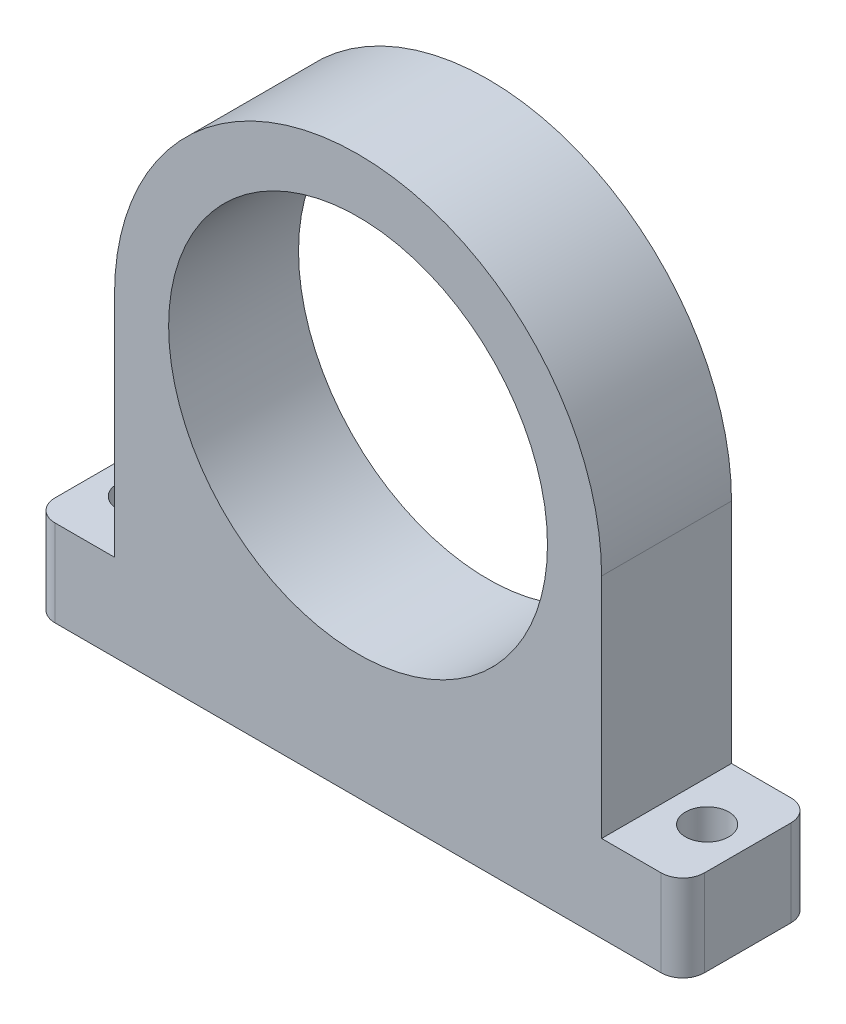
ISO-10303-21;
HEADER;
FILE_DESCRIPTION(('STEP AP214'),'2;1');
FILE_NAME('part.step','',(''),(''),'','','');
FILE_SCHEMA(('AUTOMOTIVE_DESIGN { 1 0 10303 214 1 1 1 1 }'));
ENDSEC;
DATA;
#1=APPLICATION_CONTEXT('core data for automotive mechanical design processes');
#2=APPLICATION_PROTOCOL_DEFINITION('international standard','automotive_design',2000,#1);
#3=PRODUCT_CONTEXT('',#1,'mechanical');
#4=PRODUCT('Part','Part','',(#3));
#5=PRODUCT_RELATED_PRODUCT_CATEGORY('part','',(#4));
#6=PRODUCT_DEFINITION_FORMATION('','',#4);
#7=PRODUCT_DEFINITION_CONTEXT('part definition',#1,'design');
#8=PRODUCT_DEFINITION('design','',#6,#7);
#9=PRODUCT_DEFINITION_SHAPE('','',#8);
#10=(LENGTH_UNIT() NAMED_UNIT(*) SI_UNIT(.MILLI.,.METRE.));
#11=(NAMED_UNIT(*) PLANE_ANGLE_UNIT() SI_UNIT($,.RADIAN.));
#12=(NAMED_UNIT(*) SI_UNIT($,.STERADIAN.) SOLID_ANGLE_UNIT());
#13=UNCERTAINTY_MEASURE_WITH_UNIT(LENGTH_MEASURE(1.E-05),#10,'distance_accuracy_value','');
#14=(GEOMETRIC_REPRESENTATION_CONTEXT(3) GLOBAL_UNCERTAINTY_ASSIGNED_CONTEXT((#13)) GLOBAL_UNIT_ASSIGNED_CONTEXT((#10,
#11,#12)) REPRESENTATION_CONTEXT('',''));
#15=CARTESIAN_POINT('',(0.,0.,0.));
#16=DIRECTION('',(0.,0.,1.));
#17=DIRECTION('',(1.,0.,0.));
#18=AXIS2_PLACEMENT_3D('',#15,#16,#17);
#19=CARTESIAN_POINT('',(0.,29.,6.));
#20=DIRECTION('',(0.,0.,1.));
#21=DIRECTION('',(1.,0.,0.));
#22=AXIS2_PLACEMENT_3D('',#19,#20,#21);
#23=PLANE('',#22);
#24=DIRECTION('',(-1.,0.,0.));
#25=VECTOR('',#24,1.);
#26=CARTESIAN_POINT('',(-30.,7.99999999999999,6.));
#27=LINE('',#26,#25);
#28=CARTESIAN_POINT('',(-22.5,7.99999999999999,6.));
#29=VERTEX_POINT('',#28);
#30=CARTESIAN_POINT('',(-28.,7.99999999999999,6.));
#31=VERTEX_POINT('',#30);
#32=EDGE_CURVE('E178',#29,#31,#27,.T.);
#33=ORIENTED_EDGE('',*,*,#32,.T.);
#34=DIRECTION('',(0.,-1.,0.));
#35=VECTOR('',#34,1.);
#36=CARTESIAN_POINT('',(-28.,0.,6.));
#37=LINE('',#36,#35);
#38=CARTESIAN_POINT('',(-28.,0.,6.));
#39=VERTEX_POINT('',#38);
#40=EDGE_CURVE('E258',#31,#39,#37,.T.);
#41=ORIENTED_EDGE('',*,*,#40,.T.);
#42=DIRECTION('',(1.,0.,0.));
#43=VECTOR('',#42,1.);
#44=CARTESIAN_POINT('',(30.,0.,6.));
#45=LINE('',#44,#43);
#46=CARTESIAN_POINT('',(28.,0.,6.));
#47=VERTEX_POINT('',#46);
#48=EDGE_CURVE('E152',#39,#47,#45,.T.);
#49=ORIENTED_EDGE('',*,*,#48,.T.);
#50=DIRECTION('',(0.,1.,0.));
#51=VECTOR('',#50,1.);
#52=CARTESIAN_POINT('',(28.,8.,6.));
#53=LINE('',#52,#51);
#54=CARTESIAN_POINT('',(28.,8.,6.));
#55=VERTEX_POINT('',#54);
#56=EDGE_CURVE('E150',#47,#55,#53,.T.);
#57=ORIENTED_EDGE('',*,*,#56,.T.);
#58=DIRECTION('',(-1.,0.,0.));
#59=VECTOR('',#58,1.);
#60=CARTESIAN_POINT('',(30.,8.,6.));
#61=LINE('',#60,#59);
#62=CARTESIAN_POINT('',(22.5,8.,6.));
#63=VERTEX_POINT('',#62);
#64=EDGE_CURVE('E141',#55,#63,#61,.T.);
#65=ORIENTED_EDGE('',*,*,#64,.T.);
#66=DIRECTION('',(0.,1.,0.));
#67=VECTOR('',#66,1.);
#68=CARTESIAN_POINT('',(22.5,29.,6.));
#69=LINE('',#68,#67);
#70=CARTESIAN_POINT('',(22.5,29.,6.));
#71=VERTEX_POINT('',#70);
#72=EDGE_CURVE('E146',#63,#71,#69,.T.);
#73=ORIENTED_EDGE('',*,*,#72,.T.);
#74=CARTESIAN_POINT('',(0.,29.,6.));
#75=DIRECTION('',(0.,0.,1.));
#76=DIRECTION('',(1.,0.,0.));
#77=AXIS2_PLACEMENT_3D('',#74,#75,#76);
#78=CIRCLE('',#77,22.5);
#79=CARTESIAN_POINT('',(-22.5,29.,6.));
#80=VERTEX_POINT('',#79);
#81=EDGE_CURVE('E169',#71,#80,#78,.T.);
#82=ORIENTED_EDGE('',*,*,#81,.T.);
#83=DIRECTION('',(0.,-1.,0.));
#84=VECTOR('',#83,1.);
#85=CARTESIAN_POINT('',(-22.5,29.,6.));
#86=LINE('',#85,#84);
#87=EDGE_CURVE('E172',#80,#29,#86,.T.);
#88=ORIENTED_EDGE('',*,*,#87,.T.);
#89=EDGE_LOOP('',(#33,#41,#49,#57,#65,#73,#82,#88));
#90=FACE_BOUND('',#89,.T.);
#91=CARTESIAN_POINT('',(0.,29.,6.));
#92=DIRECTION('',(0.,0.,1.));
#93=DIRECTION('',(1.,0.,0.));
#94=AXIS2_PLACEMENT_3D('',#91,#92,#93);
#95=CIRCLE('',#94,17.5);
#96=CARTESIAN_POINT('',(17.5,29.,6.));
#97=VERTEX_POINT('',#96);
#98=EDGE_CURVE('E186',#97,#97,#95,.T.);
#99=ORIENTED_EDGE('',*,*,#98,.F.);
#100=EDGE_LOOP('',(#99));
#101=FACE_BOUND('',#100,.T.);
#102=ADVANCED_FACE('F51',(#90,#101),#23,.T.);
#103=CARTESIAN_POINT('',(0.,29.,-6.));
#104=DIRECTION('',(0.,0.,1.));
#105=DIRECTION('',(1.,0.,0.));
#106=AXIS2_PLACEMENT_3D('',#103,#104,#105);
#107=PLANE('',#106);
#108=DIRECTION('',(1.,0.,0.));
#109=VECTOR('',#108,1.);
#110=CARTESIAN_POINT('',(30.,0.,-6.));
#111=LINE('',#110,#109);
#112=CARTESIAN_POINT('',(-28.,0.,-6.));
#113=VERTEX_POINT('',#112);
#114=CARTESIAN_POINT('',(28.,0.,-6.));
#115=VERTEX_POINT('',#114);
#116=EDGE_CURVE('E182',#113,#115,#111,.T.);
#117=ORIENTED_EDGE('',*,*,#116,.F.);
#118=DIRECTION('',(0.,-1.,0.));
#119=VECTOR('',#118,1.);
#120=CARTESIAN_POINT('',(-28.,29.,-6.));
#121=LINE('',#120,#119);
#122=CARTESIAN_POINT('',(-28.,7.99999999999999,-6.));
#123=VERTEX_POINT('',#122);
#124=EDGE_CURVE('E247',#113,#123,#121,.F.);
#125=ORIENTED_EDGE('',*,*,#124,.T.);
#126=DIRECTION('',(-1.,0.,0.));
#127=VECTOR('',#126,1.);
#128=CARTESIAN_POINT('',(-30.,7.99999999999999,-6.));
#129=LINE('',#128,#127);
#130=CARTESIAN_POINT('',(-22.5,7.99999999999999,-6.));
#131=VERTEX_POINT('',#130);
#132=EDGE_CURVE('E198',#131,#123,#129,.T.);
#133=ORIENTED_EDGE('',*,*,#132,.F.);
#134=DIRECTION('',(0.,-1.,0.));
#135=VECTOR('',#134,1.);
#136=CARTESIAN_POINT('',(-22.5,29.,-6.));
#137=LINE('',#136,#135);
#138=CARTESIAN_POINT('',(-22.5,29.,-6.));
#139=VERTEX_POINT('',#138);
#140=EDGE_CURVE('E195',#139,#131,#137,.T.);
#141=ORIENTED_EDGE('',*,*,#140,.F.);
#142=CARTESIAN_POINT('',(0.,29.,-6.));
#143=DIRECTION('',(0.,0.,1.));
#144=DIRECTION('',(1.,0.,0.));
#145=AXIS2_PLACEMENT_3D('',#142,#143,#144);
#146=CIRCLE('',#145,22.5);
#147=CARTESIAN_POINT('',(22.5,29.,-6.));
#148=VERTEX_POINT('',#147);
#149=EDGE_CURVE('E192',#148,#139,#146,.T.);
#150=ORIENTED_EDGE('',*,*,#149,.F.);
#151=DIRECTION('',(0.,1.,0.));
#152=VECTOR('',#151,1.);
#153=CARTESIAN_POINT('',(22.5,29.,-6.));
#154=LINE('',#153,#152);
#155=CARTESIAN_POINT('',(22.5,8.,-6.));
#156=VERTEX_POINT('',#155);
#157=EDGE_CURVE('E189',#156,#148,#154,.T.);
#158=ORIENTED_EDGE('',*,*,#157,.F.);
#159=DIRECTION('',(-1.,0.,0.));
#160=VECTOR('',#159,1.);
#161=CARTESIAN_POINT('',(30.,8.,-6.));
#162=LINE('',#161,#160);
#163=CARTESIAN_POINT('',(28.,8.,-6.));
#164=VERTEX_POINT('',#163);
#165=EDGE_CURVE('E158',#164,#156,#162,.T.);
#166=ORIENTED_EDGE('',*,*,#165,.F.);
#167=DIRECTION('',(0.,1.,0.));
#168=VECTOR('',#167,1.);
#169=CARTESIAN_POINT('',(28.,29.,-6.));
#170=LINE('',#169,#168);
#171=EDGE_CURVE('E244',#164,#115,#170,.F.);
#172=ORIENTED_EDGE('',*,*,#171,.T.);
#173=EDGE_LOOP('',(#117,#125,#133,#141,#150,#158,#166,#172));
#174=FACE_BOUND('',#173,.T.);
#175=CARTESIAN_POINT('',(0.,29.,-6.));
#176=DIRECTION('',(0.,0.,1.));
#177=DIRECTION('',(1.,0.,0.));
#178=AXIS2_PLACEMENT_3D('',#175,#176,#177);
#179=CIRCLE('',#178,17.5);
#180=CARTESIAN_POINT('',(17.5,29.,-6.));
#181=VERTEX_POINT('',#180);
#182=EDGE_CURVE('E342',#181,#181,#179,.T.);
#183=ORIENTED_EDGE('',*,*,#182,.T.);
#184=EDGE_LOOP('',(#183));
#185=FACE_BOUND('',#184,.T.);
#186=ADVANCED_FACE('F273',(#174,#185),#107,.F.);
#187=CARTESIAN_POINT('',(-30.,0.,6.));
#188=DIRECTION('',(1.,0.,0.));
#189=DIRECTION('',(0.,0.,-1.));
#190=AXIS2_PLACEMENT_3D('',#187,#188,#189);
#191=PLANE('',#190);
#192=DIRECTION('',(0.,0.,-1.));
#193=VECTOR('',#192,1.);
#194=CARTESIAN_POINT('',(-30.,7.99999999999999,6.));
#195=LINE('',#194,#193);
#196=CARTESIAN_POINT('',(-30.,7.99999999999999,4.));
#197=VERTEX_POINT('',#196);
#198=CARTESIAN_POINT('',(-30.,7.99999999999999,-4.));
#199=VERTEX_POINT('',#198);
#200=EDGE_CURVE('E181',#197,#199,#195,.T.);
#201=ORIENTED_EDGE('',*,*,#200,.T.);
#202=DIRECTION('',(0.,-1.,0.));
#203=VECTOR('',#202,1.);
#204=CARTESIAN_POINT('',(-30.,0.,-4.));
#205=LINE('',#204,#203);
#206=CARTESIAN_POINT('',(-30.,0.,-4.));
#207=VERTEX_POINT('',#206);
#208=EDGE_CURVE('E228',#199,#207,#205,.T.);
#209=ORIENTED_EDGE('',*,*,#208,.T.);
#210=DIRECTION('',(0.,0.,-1.));
#211=VECTOR('',#210,1.);
#212=CARTESIAN_POINT('',(-30.,0.,6.));
#213=LINE('',#212,#211);
#214=CARTESIAN_POINT('',(-30.,0.,4.));
#215=VERTEX_POINT('',#214);
#216=EDGE_CURVE('E221',#215,#207,#213,.T.);
#217=ORIENTED_EDGE('',*,*,#216,.F.);
#218=DIRECTION('',(0.,-1.,0.));
#219=VECTOR('',#218,1.);
#220=CARTESIAN_POINT('',(-30.,7.99999999999999,4.));
#221=LINE('',#220,#219);
#222=EDGE_CURVE('E225',#215,#197,#221,.F.);
#223=ORIENTED_EDGE('',*,*,#222,.T.);
#224=EDGE_LOOP('',(#201,#209,#217,#223));
#225=FACE_BOUND('',#224,.T.);
#226=ADVANCED_FACE('F290',(#225),#191,.F.);
#227=CARTESIAN_POINT('',(30.,0.,6.));
#228=DIRECTION('',(0.,1.,0.));
#229=DIRECTION('',(-1.,0.,0.));
#230=AXIS2_PLACEMENT_3D('',#227,#228,#229);
#231=PLANE('',#230);
#232=CARTESIAN_POINT('',(-26.25,0.,0.));
#233=DIRECTION('',(0.,1.,0.));
#234=DIRECTION('',(0.,0.,1.));
#235=AXIS2_PLACEMENT_3D('',#232,#233,#234);
#236=CIRCLE('',#235,2.);
#237=CARTESIAN_POINT('',(-26.25,0.,2.));
#238=VERTEX_POINT('',#237);
#239=EDGE_CURVE('E336',#238,#238,#236,.T.);
#240=ORIENTED_EDGE('',*,*,#239,.T.);
#241=EDGE_LOOP('',(#240));
#242=FACE_BOUND('',#241,.T.);
#243=CARTESIAN_POINT('',(26.25,0.,0.));
#244=DIRECTION('',(0.,1.,0.));
#245=DIRECTION('',(0.,0.,-1.));
#246=AXIS2_PLACEMENT_3D('',#243,#244,#245);
#247=CIRCLE('',#246,2.);
#248=CARTESIAN_POINT('',(26.25,0.,-2.00000000000001));
#249=VERTEX_POINT('',#248);
#250=EDGE_CURVE('E337',#249,#249,#247,.T.);
#251=ORIENTED_EDGE('',*,*,#250,.T.);
#252=EDGE_LOOP('',(#251));
#253=FACE_BOUND('',#252,.T.);
#254=ORIENTED_EDGE('',*,*,#216,.T.);
#255=CARTESIAN_POINT('',(-28.,0.,-4.));
#256=DIRECTION('',(0.,1.,0.));
#257=DIRECTION('',(-1.,0.,0.));
#258=AXIS2_PLACEMENT_3D('',#255,#256,#257);
#259=CIRCLE('',#258,2.);
#260=EDGE_CURVE('E241',#207,#113,#259,.F.);
#261=ORIENTED_EDGE('',*,*,#260,.T.);
#262=ORIENTED_EDGE('',*,*,#116,.T.);
#263=CARTESIAN_POINT('',(28.,0.,-4.));
#264=DIRECTION('',(0.,1.,0.));
#265=DIRECTION('',(-1.,0.,0.));
#266=AXIS2_PLACEMENT_3D('',#263,#264,#265);
#267=CIRCLE('',#266,2.);
#268=CARTESIAN_POINT('',(30.,0.,-4.));
#269=VERTEX_POINT('',#268);
#270=EDGE_CURVE('E232',#115,#269,#267,.F.);
#271=ORIENTED_EDGE('',*,*,#270,.T.);
#272=DIRECTION('',(0.,0.,-1.));
#273=VECTOR('',#272,1.);
#274=CARTESIAN_POINT('',(30.,0.,6.));
#275=LINE('',#274,#273);
#276=CARTESIAN_POINT('',(30.,0.,4.));
#277=VERTEX_POINT('',#276);
#278=EDGE_CURVE('E217',#277,#269,#275,.T.);
#279=ORIENTED_EDGE('',*,*,#278,.F.);
#280=CARTESIAN_POINT('',(28.,0.,4.));
#281=DIRECTION('',(0.,1.,0.));
#282=DIRECTION('',(-1.,0.,0.));
#283=AXIS2_PLACEMENT_3D('',#280,#281,#282);
#284=CIRCLE('',#283,2.);
#285=EDGE_CURVE('E235',#277,#47,#284,.F.);
#286=ORIENTED_EDGE('',*,*,#285,.T.);
#287=ORIENTED_EDGE('',*,*,#48,.F.);
#288=CARTESIAN_POINT('',(-28.,0.,4.));
#289=DIRECTION('',(0.,1.,0.));
#290=DIRECTION('',(-1.,0.,0.));
#291=AXIS2_PLACEMENT_3D('',#288,#289,#290);
#292=CIRCLE('',#291,2.);
#293=EDGE_CURVE('E238',#39,#215,#292,.F.);
#294=ORIENTED_EDGE('',*,*,#293,.T.);
#295=EDGE_LOOP('',(#254,#261,#262,#271,#279,#286,#287,#294));
#296=FACE_BOUND('',#295,.T.);
#297=ADVANCED_FACE('F277',(#242,#253,#296),#231,.F.);
#298=CARTESIAN_POINT('',(30.,0.,6.));
#299=DIRECTION('',(-1.,0.,0.));
#300=DIRECTION('',(0.,0.,1.));
#301=AXIS2_PLACEMENT_3D('',#298,#299,#300);
#302=PLANE('',#301);
#303=DIRECTION('',(0.,0.,-1.));
#304=VECTOR('',#303,1.);
#305=CARTESIAN_POINT('',(30.,8.,6.));
#306=LINE('',#305,#304);
#307=CARTESIAN_POINT('',(30.,8.,4.));
#308=VERTEX_POINT('',#307);
#309=CARTESIAN_POINT('',(30.,8.,-4.));
#310=VERTEX_POINT('',#309);
#311=EDGE_CURVE('E162',#308,#310,#306,.T.);
#312=ORIENTED_EDGE('',*,*,#311,.F.);
#313=DIRECTION('',(0.,1.,0.));
#314=VECTOR('',#313,1.);
#315=CARTESIAN_POINT('',(30.,0.,4.));
#316=LINE('',#315,#314);
#317=EDGE_CURVE('E11',#308,#277,#316,.F.);
#318=ORIENTED_EDGE('',*,*,#317,.T.);
#319=ORIENTED_EDGE('',*,*,#278,.T.);
#320=DIRECTION('',(0.,1.,0.));
#321=VECTOR('',#320,1.);
#322=CARTESIAN_POINT('',(30.,0.,-4.));
#323=LINE('',#322,#321);
#324=EDGE_CURVE('E60',#269,#310,#323,.T.);
#325=ORIENTED_EDGE('',*,*,#324,.T.);
#326=EDGE_LOOP('',(#312,#318,#319,#325));
#327=FACE_BOUND('',#326,.T.);
#328=ADVANCED_FACE('F267',(#327),#302,.F.);
#329=CARTESIAN_POINT('',(30.,8.,6.));
#330=DIRECTION('',(0.,-1.,0.));
#331=DIRECTION('',(1.,0.,0.));
#332=AXIS2_PLACEMENT_3D('',#329,#330,#331);
#333=PLANE('',#332);
#334=CARTESIAN_POINT('',(26.25,7.99999999999999,0.));
#335=DIRECTION('',(0.,1.,0.));
#336=DIRECTION('',(0.,0.,-1.));
#337=AXIS2_PLACEMENT_3D('',#334,#335,#336);
#338=CIRCLE('',#337,2.);
#339=CARTESIAN_POINT('',(26.25,7.99999999999999,-2.00000000000001));
#340=VERTEX_POINT('',#339);
#341=EDGE_CURVE('E345',#340,#340,#338,.T.);
#342=ORIENTED_EDGE('',*,*,#341,.F.);
#343=EDGE_LOOP('',(#342));
#344=FACE_BOUND('',#343,.T.);
#345=ORIENTED_EDGE('',*,*,#64,.F.);
#346=CARTESIAN_POINT('',(28.,8.,4.));
#347=DIRECTION('',(0.,-1.,0.));
#348=DIRECTION('',(1.,0.,0.));
#349=AXIS2_PLACEMENT_3D('',#346,#347,#348);
#350=CIRCLE('',#349,2.);
#351=EDGE_CURVE('E75',#55,#308,#350,.F.);
#352=ORIENTED_EDGE('',*,*,#351,.T.);
#353=ORIENTED_EDGE('',*,*,#311,.T.);
#354=CARTESIAN_POINT('',(28.,8.,-4.));
#355=DIRECTION('',(0.,-1.,0.));
#356=DIRECTION('',(1.,0.,0.));
#357=AXIS2_PLACEMENT_3D('',#354,#355,#356);
#358=CIRCLE('',#357,2.);
#359=EDGE_CURVE('E67',#310,#164,#358,.F.);
#360=ORIENTED_EDGE('',*,*,#359,.T.);
#361=ORIENTED_EDGE('',*,*,#165,.T.);
#362=DIRECTION('',(0.,0.,-1.));
#363=VECTOR('',#362,1.);
#364=CARTESIAN_POINT('',(22.5,8.,6.));
#365=LINE('',#364,#363);
#366=EDGE_CURVE('E155',#63,#156,#365,.T.);
#367=ORIENTED_EDGE('',*,*,#366,.F.);
#368=EDGE_LOOP('',(#345,#352,#353,#360,#361,#367));
#369=FACE_BOUND('',#368,.T.);
#370=ADVANCED_FACE('F156',(#344,#369),#333,.F.);
#371=CARTESIAN_POINT('',(22.5,29.,6.));
#372=DIRECTION('',(-1.,0.,0.));
#373=DIRECTION('',(0.,-1.,0.));
#374=AXIS2_PLACEMENT_3D('',#371,#372,#373);
#375=PLANE('',#374);
#376=ORIENTED_EDGE('',*,*,#157,.T.);
#377=DIRECTION('',(0.,0.,-1.));
#378=VECTOR('',#377,1.);
#379=CARTESIAN_POINT('',(22.5,29.,6.));
#380=LINE('',#379,#378);
#381=EDGE_CURVE('E163',#71,#148,#380,.T.);
#382=ORIENTED_EDGE('',*,*,#381,.F.);
#383=ORIENTED_EDGE('',*,*,#72,.F.);
#384=ORIENTED_EDGE('',*,*,#366,.T.);
#385=EDGE_LOOP('',(#376,#382,#383,#384));
#386=FACE_BOUND('',#385,.T.);
#387=ADVANCED_FACE('F165',(#386),#375,.F.);
#388=CARTESIAN_POINT('',(0.,29.,6.));
#389=DIRECTION('',(0.,0.,-1.));
#390=DIRECTION('',(-1.,0.,0.));
#391=AXIS2_PLACEMENT_3D('',#388,#389,#390);
#392=CYLINDRICAL_SURFACE('',#391,22.5);
#393=ORIENTED_EDGE('',*,*,#149,.T.);
#394=DIRECTION('',(0.,0.,-1.));
#395=VECTOR('',#394,1.);
#396=CARTESIAN_POINT('',(-22.5,29.,6.));
#397=LINE('',#396,#395);
#398=EDGE_CURVE('E209',#80,#139,#397,.T.);
#399=ORIENTED_EDGE('',*,*,#398,.F.);
#400=ORIENTED_EDGE('',*,*,#81,.F.);
#401=ORIENTED_EDGE('',*,*,#381,.T.);
#402=EDGE_LOOP('',(#393,#399,#400,#401));
#403=FACE_BOUND('',#402,.T.);
#404=ADVANCED_FACE('F305',(#403),#392,.T.);
#405=CARTESIAN_POINT('',(-22.5,29.,6.));
#406=DIRECTION('',(1.,0.,0.));
#407=DIRECTION('',(0.,1.,0.));
#408=AXIS2_PLACEMENT_3D('',#405,#406,#407);
#409=PLANE('',#408);
#410=ORIENTED_EDGE('',*,*,#140,.T.);
#411=DIRECTION('',(0.,0.,-1.));
#412=VECTOR('',#411,1.);
#413=CARTESIAN_POINT('',(-22.5,7.99999999999999,6.));
#414=LINE('',#413,#412);
#415=EDGE_CURVE('E205',#29,#131,#414,.T.);
#416=ORIENTED_EDGE('',*,*,#415,.F.);
#417=ORIENTED_EDGE('',*,*,#87,.F.);
#418=ORIENTED_EDGE('',*,*,#398,.T.);
#419=EDGE_LOOP('',(#410,#416,#417,#418));
#420=FACE_BOUND('',#419,.T.);
#421=ADVANCED_FACE('F302',(#420),#409,.F.);
#422=CARTESIAN_POINT('',(-30.,7.99999999999999,6.));
#423=DIRECTION('',(0.,-1.,0.));
#424=DIRECTION('',(0.,0.,-1.));
#425=AXIS2_PLACEMENT_3D('',#422,#423,#424);
#426=PLANE('',#425);
#427=CARTESIAN_POINT('',(-26.25,7.99999999999999,0.));
#428=DIRECTION('',(0.,1.,0.));
#429=DIRECTION('',(0.,0.,1.));
#430=AXIS2_PLACEMENT_3D('',#427,#428,#429);
#431=CIRCLE('',#430,2.);
#432=CARTESIAN_POINT('',(-26.25,7.99999999999999,2.));
#433=VERTEX_POINT('',#432);
#434=EDGE_CURVE('E333',#433,#433,#431,.T.);
#435=ORIENTED_EDGE('',*,*,#434,.F.);
#436=EDGE_LOOP('',(#435));
#437=FACE_BOUND('',#436,.T.);
#438=ORIENTED_EDGE('',*,*,#132,.T.);
#439=CARTESIAN_POINT('',(-28.,7.99999999999999,-4.));
#440=DIRECTION('',(0.,-1.,0.));
#441=DIRECTION('',(0.,0.,-1.));
#442=AXIS2_PLACEMENT_3D('',#439,#440,#441);
#443=CIRCLE('',#442,2.);
#444=EDGE_CURVE('E253',#123,#199,#443,.F.);
#445=ORIENTED_EDGE('',*,*,#444,.T.);
#446=ORIENTED_EDGE('',*,*,#200,.F.);
#447=CARTESIAN_POINT('',(-28.,7.99999999999999,4.));
#448=DIRECTION('',(0.,-1.,0.));
#449=DIRECTION('',(0.,0.,-1.));
#450=AXIS2_PLACEMENT_3D('',#447,#448,#449);
#451=CIRCLE('',#450,2.);
#452=EDGE_CURVE('E250',#197,#31,#451,.F.);
#453=ORIENTED_EDGE('',*,*,#452,.T.);
#454=ORIENTED_EDGE('',*,*,#32,.F.);
#455=ORIENTED_EDGE('',*,*,#415,.T.);
#456=EDGE_LOOP('',(#438,#445,#446,#453,#454,#455));
#457=FACE_BOUND('',#456,.T.);
#458=ADVANCED_FACE('F287',(#437,#457),#426,.F.);
#459=CARTESIAN_POINT('',(0.,29.,6.));
#460=DIRECTION('',(0.,0.,-1.));
#461=DIRECTION('',(-1.,0.,0.));
#462=AXIS2_PLACEMENT_3D('',#459,#460,#461);
#463=CYLINDRICAL_SURFACE('',#462,17.5);
#464=ORIENTED_EDGE('',*,*,#98,.T.);
#465=EDGE_LOOP('',(#464));
#466=FACE_BOUND('',#465,.T.);
#467=ORIENTED_EDGE('',*,*,#182,.F.);
#468=EDGE_LOOP('',(#467));
#469=FACE_BOUND('',#468,.T.);
#470=ADVANCED_FACE('F321',(#466,#469),#463,.F.);
#471=CARTESIAN_POINT('',(-26.25,0.,0.));
#472=DIRECTION('',(0.,1.,0.));
#473=DIRECTION('',(0.,0.,1.));
#474=AXIS2_PLACEMENT_3D('',#471,#472,#473);
#475=CYLINDRICAL_SURFACE('',#474,2.);
#476=ORIENTED_EDGE('',*,*,#239,.F.);
#477=EDGE_LOOP('',(#476));
#478=FACE_BOUND('',#477,.T.);
#479=ORIENTED_EDGE('',*,*,#434,.T.);
#480=EDGE_LOOP('',(#479));
#481=FACE_BOUND('',#480,.T.);
#482=ADVANCED_FACE('F329',(#478,#481),#475,.F.);
#483=CARTESIAN_POINT('',(26.25,0.,0.));
#484=DIRECTION('',(0.,1.,0.));
#485=DIRECTION('',(0.,0.,1.));
#486=AXIS2_PLACEMENT_3D('',#483,#484,#485);
#487=CYLINDRICAL_SURFACE('',#486,2.);
#488=ORIENTED_EDGE('',*,*,#250,.F.);
#489=EDGE_LOOP('',(#488));
#490=FACE_BOUND('',#489,.T.);
#491=ORIENTED_EDGE('',*,*,#341,.T.);
#492=EDGE_LOOP('',(#491));
#493=FACE_BOUND('',#492,.T.);
#494=ADVANCED_FACE('F368',(#490,#493),#487,.F.);
#495=CARTESIAN_POINT('',(-28.,0.,-4.));
#496=DIRECTION('',(0.,-1.,0.));
#497=DIRECTION('',(0.,0.,-1.));
#498=AXIS2_PLACEMENT_3D('',#495,#496,#497);
#499=CYLINDRICAL_SURFACE('',#498,2.);
#500=ORIENTED_EDGE('',*,*,#444,.F.);
#501=ORIENTED_EDGE('',*,*,#124,.F.);
#502=ORIENTED_EDGE('',*,*,#260,.F.);
#503=ORIENTED_EDGE('',*,*,#208,.F.);
#504=EDGE_LOOP('',(#500,#501,#502,#503));
#505=FACE_BOUND('',#504,.T.);
#506=ADVANCED_FACE('F283',(#505),#499,.T.);
#507=CARTESIAN_POINT('',(-28.,29.,4.));
#508=DIRECTION('',(0.,1.,0.));
#509=DIRECTION('',(0.,0.,1.));
#510=AXIS2_PLACEMENT_3D('',#507,#508,#509);
#511=CYLINDRICAL_SURFACE('',#510,2.);
#512=ORIENTED_EDGE('',*,*,#452,.F.);
#513=ORIENTED_EDGE('',*,*,#222,.F.);
#514=ORIENTED_EDGE('',*,*,#293,.F.);
#515=ORIENTED_EDGE('',*,*,#40,.F.);
#516=EDGE_LOOP('',(#512,#513,#514,#515));
#517=FACE_BOUND('',#516,.T.);
#518=ADVANCED_FACE('F294',(#517),#511,.T.);
#519=CARTESIAN_POINT('',(28.,29.,4.));
#520=DIRECTION('',(0.,-1.,0.));
#521=DIRECTION('',(0.,0.,-1.));
#522=AXIS2_PLACEMENT_3D('',#519,#520,#521);
#523=CYLINDRICAL_SURFACE('',#522,2.);
#524=ORIENTED_EDGE('',*,*,#285,.F.);
#525=ORIENTED_EDGE('',*,*,#317,.F.);
#526=ORIENTED_EDGE('',*,*,#351,.F.);
#527=ORIENTED_EDGE('',*,*,#56,.F.);
#528=EDGE_LOOP('',(#524,#525,#526,#527));
#529=FACE_BOUND('',#528,.T.);
#530=ADVANCED_FACE('F358',(#529),#523,.T.);
#531=CARTESIAN_POINT('',(28.,0.,-4.));
#532=DIRECTION('',(0.,1.,0.));
#533=DIRECTION('',(0.,0.,1.));
#534=AXIS2_PLACEMENT_3D('',#531,#532,#533);
#535=CYLINDRICAL_SURFACE('',#534,2.);
#536=ORIENTED_EDGE('',*,*,#270,.F.);
#537=ORIENTED_EDGE('',*,*,#171,.F.);
#538=ORIENTED_EDGE('',*,*,#359,.F.);
#539=ORIENTED_EDGE('',*,*,#324,.F.);
#540=EDGE_LOOP('',(#536,#537,#538,#539));
#541=FACE_BOUND('',#540,.T.);
#542=ADVANCED_FACE('F53',(#541),#535,.T.);
#543=CLOSED_SHELL('',(#102,#186,#226,#297,#328,#370,#387,#404,#421,#458,#470,#482,#494,#506,
#518,#530,#542));
#544=MANIFOLD_SOLID_BREP('B2',#543);
#545=ADVANCED_BREP_SHAPE_REPRESENTATION('',(#18,#544),#14);
#546=SHAPE_DEFINITION_REPRESENTATION(#9,#545);
ENDSEC;
END-ISO-10303-21;
